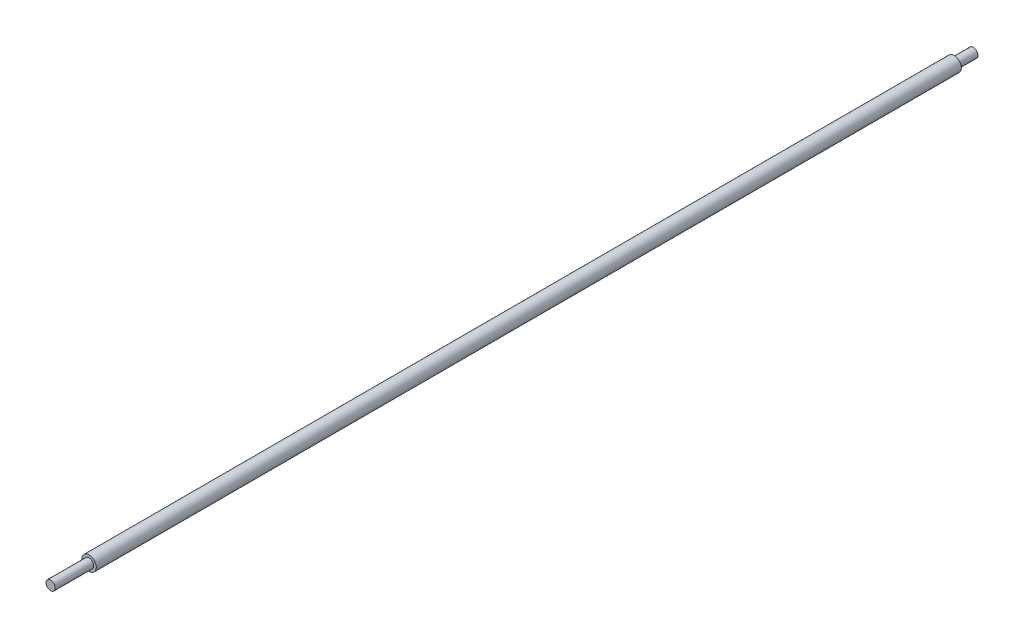
ISO-10303-21;
HEADER;
FILE_DESCRIPTION(('STEP AP214'),'2;1');
FILE_NAME('part.step','',(''),(''),'','','');
FILE_SCHEMA(('AUTOMOTIVE_DESIGN { 1 0 10303 214 1 1 1 1 }'));
ENDSEC;
DATA;
#1=APPLICATION_CONTEXT('core data for automotive mechanical design processes');
#2=APPLICATION_PROTOCOL_DEFINITION('international standard','automotive_design',2000,#1);
#3=PRODUCT_CONTEXT('',#1,'mechanical');
#4=PRODUCT('Part','Part','',(#3));
#5=PRODUCT_RELATED_PRODUCT_CATEGORY('part','',(#4));
#6=PRODUCT_DEFINITION_FORMATION('','',#4);
#7=PRODUCT_DEFINITION_CONTEXT('part definition',#1,'design');
#8=PRODUCT_DEFINITION('design','',#6,#7);
#9=PRODUCT_DEFINITION_SHAPE('','',#8);
#10=(LENGTH_UNIT() NAMED_UNIT(*) SI_UNIT(.MILLI.,.METRE.));
#11=(NAMED_UNIT(*) PLANE_ANGLE_UNIT() SI_UNIT($,.RADIAN.));
#12=(NAMED_UNIT(*) SI_UNIT($,.STERADIAN.) SOLID_ANGLE_UNIT());
#13=UNCERTAINTY_MEASURE_WITH_UNIT(LENGTH_MEASURE(1.E-05),#10,'distance_accuracy_value','');
#14=(GEOMETRIC_REPRESENTATION_CONTEXT(3) GLOBAL_UNCERTAINTY_ASSIGNED_CONTEXT((#13)) GLOBAL_UNIT_ASSIGNED_CONTEXT((#10,
#11,#12)) REPRESENTATION_CONTEXT('',''));
#15=CARTESIAN_POINT('',(0.,0.,0.));
#16=DIRECTION('',(0.,0.,1.));
#17=DIRECTION('',(1.,0.,0.));
#18=AXIS2_PLACEMENT_3D('',#15,#16,#17);
#19=CARTESIAN_POINT('',(0.,0.,609.6));
#20=DIRECTION('',(0.,0.,-1.));
#21=DIRECTION('',(-1.,0.,0.));
#22=AXIS2_PLACEMENT_3D('',#19,#20,#21);
#23=CYLINDRICAL_SURFACE('',#22,4.7625);
#24=CARTESIAN_POINT('',(0.,0.,584.2));
#25=DIRECTION('',(0.,0.,1.));
#26=DIRECTION('',(1.,0.,0.));
#27=AXIS2_PLACEMENT_3D('',#24,#25,#26);
#28=CIRCLE('',#27,4.7625);
#29=CARTESIAN_POINT('',(-4.7625,0.,584.2));
#30=VERTEX_POINT('',#29);
#31=EDGE_CURVE('E10',#30,#30,#28,.T.);
#32=CARTESIAN_POINT('',(0.,0.,12.7));
#33=DIRECTION('',(0.,0.,-1.));
#34=DIRECTION('',(-1.,0.,0.));
#35=AXIS2_PLACEMENT_3D('',#32,#33,#34);
#36=CIRCLE('',#35,4.7625);
#37=CARTESIAN_POINT('',(-4.7625,0.,12.6999999999999));
#38=VERTEX_POINT('',#37);
#39=EDGE_CURVE('E47',#38,#38,#36,.T.);
#40=CARTESIAN_POINT('',(-4.7625,0.,584.2));
#41=CARTESIAN_POINT('',(-4.7625,0.,578.246875));
#42=CARTESIAN_POINT('',(-4.7625,0.,572.29375));
#43=CARTESIAN_POINT('',(-4.7625,0.,560.3875));
#44=CARTESIAN_POINT('',(-4.7625,0.,554.434375));
#45=CARTESIAN_POINT('',(-4.7625,0.,542.528125));
#46=CARTESIAN_POINT('',(-4.7625,0.,536.575));
#47=CARTESIAN_POINT('',(-4.7625,0.,524.66875));
#48=CARTESIAN_POINT('',(-4.7625,0.,518.715625));
#49=CARTESIAN_POINT('',(-4.7625,0.,506.809375));
#50=CARTESIAN_POINT('',(-4.7625,0.,500.85625));
#51=CARTESIAN_POINT('',(-4.7625,0.,488.95));
#52=CARTESIAN_POINT('',(-4.7625,0.,482.996875));
#53=CARTESIAN_POINT('',(-4.7625,0.,471.090625));
#54=CARTESIAN_POINT('',(-4.7625,0.,465.1375));
#55=CARTESIAN_POINT('',(-4.7625,0.,453.23125));
#56=CARTESIAN_POINT('',(-4.7625,0.,447.278125));
#57=CARTESIAN_POINT('',(-4.7625,0.,435.371875));
#58=CARTESIAN_POINT('',(-4.7625,0.,429.41875));
#59=CARTESIAN_POINT('',(-4.7625,0.,417.5125));
#60=CARTESIAN_POINT('',(-4.7625,0.,411.559375));
#61=CARTESIAN_POINT('',(-4.7625,0.,399.653125));
#62=CARTESIAN_POINT('',(-4.7625,0.,393.7));
#63=CARTESIAN_POINT('',(-4.7625,0.,381.79375));
#64=CARTESIAN_POINT('',(-4.7625,0.,375.840625));
#65=CARTESIAN_POINT('',(-4.7625,0.,363.934375));
#66=CARTESIAN_POINT('',(-4.7625,0.,357.98125));
#67=CARTESIAN_POINT('',(-4.7625,0.,346.075));
#68=CARTESIAN_POINT('',(-4.7625,0.,340.121875));
#69=CARTESIAN_POINT('',(-4.7625,0.,328.215625));
#70=CARTESIAN_POINT('',(-4.7625,0.,322.2625));
#71=CARTESIAN_POINT('',(-4.7625,0.,310.35625));
#72=CARTESIAN_POINT('',(-4.7625,0.,304.403125));
#73=CARTESIAN_POINT('',(-4.7625,0.,292.496875));
#74=CARTESIAN_POINT('',(-4.7625,0.,286.54375));
#75=CARTESIAN_POINT('',(-4.7625,0.,274.6375));
#76=CARTESIAN_POINT('',(-4.7625,0.,268.684375));
#77=CARTESIAN_POINT('',(-4.7625,0.,256.778125));
#78=CARTESIAN_POINT('',(-4.7625,0.,250.825));
#79=CARTESIAN_POINT('',(-4.7625,0.,238.91875));
#80=CARTESIAN_POINT('',(-4.7625,0.,232.965625));
#81=CARTESIAN_POINT('',(-4.7625,0.,221.059375));
#82=CARTESIAN_POINT('',(-4.7625,0.,215.10625));
#83=CARTESIAN_POINT('',(-4.7625,0.,203.2));
#84=CARTESIAN_POINT('',(-4.7625,0.,197.246875));
#85=CARTESIAN_POINT('',(-4.7625,0.,185.340625));
#86=CARTESIAN_POINT('',(-4.7625,0.,179.3875));
#87=CARTESIAN_POINT('',(-4.7625,0.,167.48125));
#88=CARTESIAN_POINT('',(-4.7625,0.,161.528125));
#89=CARTESIAN_POINT('',(-4.7625,0.,149.621875));
#90=CARTESIAN_POINT('',(-4.7625,0.,143.66875));
#91=CARTESIAN_POINT('',(-4.7625,0.,131.7625));
#92=CARTESIAN_POINT('',(-4.7625,0.,125.809375));
#93=CARTESIAN_POINT('',(-4.7625,0.,113.903125));
#94=CARTESIAN_POINT('',(-4.7625,0.,107.95));
#95=CARTESIAN_POINT('',(-4.7625,0.,96.04375));
#96=CARTESIAN_POINT('',(-4.7625,0.,90.090625));
#97=CARTESIAN_POINT('',(-4.7625,0.,78.184375));
#98=CARTESIAN_POINT('',(-4.7625,0.,72.23125));
#99=CARTESIAN_POINT('',(-4.7625,0.,60.325));
#100=CARTESIAN_POINT('',(-4.7625,0.,54.371875));
#101=CARTESIAN_POINT('',(-4.7625,0.,42.465625));
#102=CARTESIAN_POINT('',(-4.7625,0.,36.5124999999999));
#103=CARTESIAN_POINT('',(-4.7625,0.,24.6062499999999));
#104=CARTESIAN_POINT('',(-4.7625,0.,18.6531249999999));
#105=CARTESIAN_POINT('',(-4.7625,0.,12.6999999999999));
#106=B_SPLINE_CURVE_WITH_KNOTS('',3,(#40,#41,#42,#43,#44,#45,#46,#47,#48,#49,#50,#51,#52,#53,
#54,#55,#56,#57,#58,#59,#60,#61,#62,#63,#64,#65,#66,#67,#68,#69,#70,#71,#72,#73,#74,#75,#76,#77,
#78,#79,#80,#81,#82,#83,#84,#85,#86,#87,#88,#89,#90,#91,#92,#93,#94,#95,#96,#97,#98,#99,#100,
#101,#102,#103,#104,#105),.UNSPECIFIED.,.F.,.F.,(4,2,2,2,2,2,2,2,2,2,2,2,2,2,2,2,2,2,2,2,2,2,2,
2,2,2,2,2,2,2,2,2,4),(0.,17.8593749999999,35.7187499999999,53.5781249999999,71.4374999999999,
89.2968749999999,107.15625,125.015625,142.875,160.734375,178.59375,196.453125,214.3125,
232.171875,250.03125,267.890625,285.75,303.609375,321.46875,339.328125,357.1875,375.046875,
392.90625,410.765625,428.625,446.484375,464.34375,482.203125,500.0625,517.921875,535.78125,
553.640625,571.5),.UNSPECIFIED.);
#107=EDGE_CURVE('BSEAM32',#30,#38,#106,.T.);
#108=ORIENTED_EDGE('',*,*,#31,.F.);
#109=ORIENTED_EDGE('',*,*,#39,.F.);
#110=ORIENTED_EDGE('',*,*,#107,.T.);
#111=ORIENTED_EDGE('',*,*,#107,.F.);
#112=EDGE_LOOP('',(#108,#110,#109,#111));
#113=FACE_BOUND('',#112,.T.);
#114=ADVANCED_FACE('F32',(#113),#23,.T.);
#115=CARTESIAN_POINT('',(0.,0.,584.2));
#116=DIRECTION('',(0.,0.,1.));
#117=DIRECTION('',(1.,0.,0.));
#118=AXIS2_PLACEMENT_3D('',#115,#116,#117);
#119=PLANE('',#118);
#120=CARTESIAN_POINT('',(0.,0.,584.2));
#121=DIRECTION('',(0.,0.,1.));
#122=DIRECTION('',(1.,0.,0.));
#123=AXIS2_PLACEMENT_3D('',#120,#121,#122);
#124=CIRCLE('',#123,3.0607);
#125=CARTESIAN_POINT('',(3.0607,0.,584.2));
#126=VERTEX_POINT('',#125);
#127=EDGE_CURVE('E38',#126,#126,#124,.T.);
#128=ORIENTED_EDGE('',*,*,#127,.F.);
#129=EDGE_LOOP('',(#128));
#130=FACE_BOUND('',#129,.T.);
#131=ORIENTED_EDGE('',*,*,#31,.T.);
#132=EDGE_LOOP('',(#131));
#133=FACE_BOUND('',#132,.T.);
#134=ADVANCED_FACE('F69',(#130,#133),#119,.T.);
#135=CARTESIAN_POINT('',(0.,0.,584.2));
#136=DIRECTION('',(0.,0.,1.));
#137=DIRECTION('',(1.,0.,0.));
#138=AXIS2_PLACEMENT_3D('',#135,#136,#137);
#139=CYLINDRICAL_SURFACE('',#138,3.0607);
#140=ORIENTED_EDGE('',*,*,#127,.T.);
#141=EDGE_LOOP('',(#140));
#142=FACE_BOUND('',#141,.T.);
#143=CARTESIAN_POINT('',(0.,0.,609.6));
#144=DIRECTION('',(0.,0.,1.));
#145=DIRECTION('',(1.,0.,0.));
#146=AXIS2_PLACEMENT_3D('',#143,#144,#145);
#147=CIRCLE('',#146,3.0607);
#148=CARTESIAN_POINT('',(3.0607,0.,609.6));
#149=VERTEX_POINT('',#148);
#150=EDGE_CURVE('E42',#149,#149,#147,.T.);
#151=ORIENTED_EDGE('',*,*,#150,.F.);
#152=EDGE_LOOP('',(#151));
#153=FACE_BOUND('',#152,.T.);
#154=ADVANCED_FACE('F74',(#142,#153),#139,.T.);
#155=CARTESIAN_POINT('',(0.,0.,609.6));
#156=DIRECTION('',(0.,0.,1.));
#157=DIRECTION('',(1.,0.,0.));
#158=AXIS2_PLACEMENT_3D('',#155,#156,#157);
#159=PLANE('',#158);
#160=ORIENTED_EDGE('',*,*,#150,.T.);
#161=EDGE_LOOP('',(#160));
#162=FACE_BOUND('',#161,.T.);
#163=ADVANCED_FACE('F64',(#162),#159,.T.);
#164=CARTESIAN_POINT('',(0.,0.,12.7));
#165=DIRECTION('',(0.,0.,-1.));
#166=DIRECTION('',(-1.,0.,0.));
#167=AXIS2_PLACEMENT_3D('',#164,#165,#166);
#168=PLANE('',#167);
#169=CARTESIAN_POINT('',(0.,0.,12.7));
#170=DIRECTION('',(0.,0.,-1.));
#171=DIRECTION('',(-1.,0.,0.));
#172=AXIS2_PLACEMENT_3D('',#169,#170,#171);
#173=CIRCLE('',#172,3.0607);
#174=CARTESIAN_POINT('',(-3.0607,0.,12.7));
#175=VERTEX_POINT('',#174);
#176=EDGE_CURVE('E51',#175,#175,#173,.T.);
#177=ORIENTED_EDGE('',*,*,#176,.F.);
#178=EDGE_LOOP('',(#177));
#179=FACE_BOUND('',#178,.T.);
#180=ORIENTED_EDGE('',*,*,#39,.T.);
#181=EDGE_LOOP('',(#180));
#182=FACE_BOUND('',#181,.T.);
#183=ADVANCED_FACE('F61',(#179,#182),#168,.T.);
#184=CARTESIAN_POINT('',(0.,0.,12.7));
#185=DIRECTION('',(0.,0.,-1.));
#186=DIRECTION('',(-1.,0.,0.));
#187=AXIS2_PLACEMENT_3D('',#184,#185,#186);
#188=CYLINDRICAL_SURFACE('',#187,3.0607);
#189=ORIENTED_EDGE('',*,*,#176,.T.);
#190=EDGE_LOOP('',(#189));
#191=FACE_BOUND('',#190,.T.);
#192=CARTESIAN_POINT('',(0.,0.,0.));
#193=DIRECTION('',(0.,0.,-1.));
#194=DIRECTION('',(-1.,0.,0.));
#195=AXIS2_PLACEMENT_3D('',#192,#193,#194);
#196=CIRCLE('',#195,3.0607);
#197=CARTESIAN_POINT('',(-3.0607,0.,0.));
#198=VERTEX_POINT('',#197);
#199=EDGE_CURVE('E52',#198,#198,#196,.T.);
#200=ORIENTED_EDGE('',*,*,#199,.F.);
#201=EDGE_LOOP('',(#200));
#202=FACE_BOUND('',#201,.T.);
#203=ADVANCED_FACE('F58',(#191,#202),#188,.T.);
#204=CARTESIAN_POINT('',(0.,0.,0.));
#205=DIRECTION('',(0.,0.,1.));
#206=DIRECTION('',(1.,0.,0.));
#207=AXIS2_PLACEMENT_3D('',#204,#205,#206);
#208=PLANE('',#207);
#209=ORIENTED_EDGE('',*,*,#199,.T.);
#210=EDGE_LOOP('',(#209));
#211=FACE_BOUND('',#210,.T.);
#212=ADVANCED_FACE('F84',(#211),#208,.F.);
#213=CLOSED_SHELL('',(#114,#134,#154,#163,#183,#203,#212));
#214=MANIFOLD_SOLID_BREP('B2',#213);
#215=ADVANCED_BREP_SHAPE_REPRESENTATION('',(#18,#214),#14);
#216=SHAPE_DEFINITION_REPRESENTATION(#9,#215);
ENDSEC;
END-ISO-10303-21;
